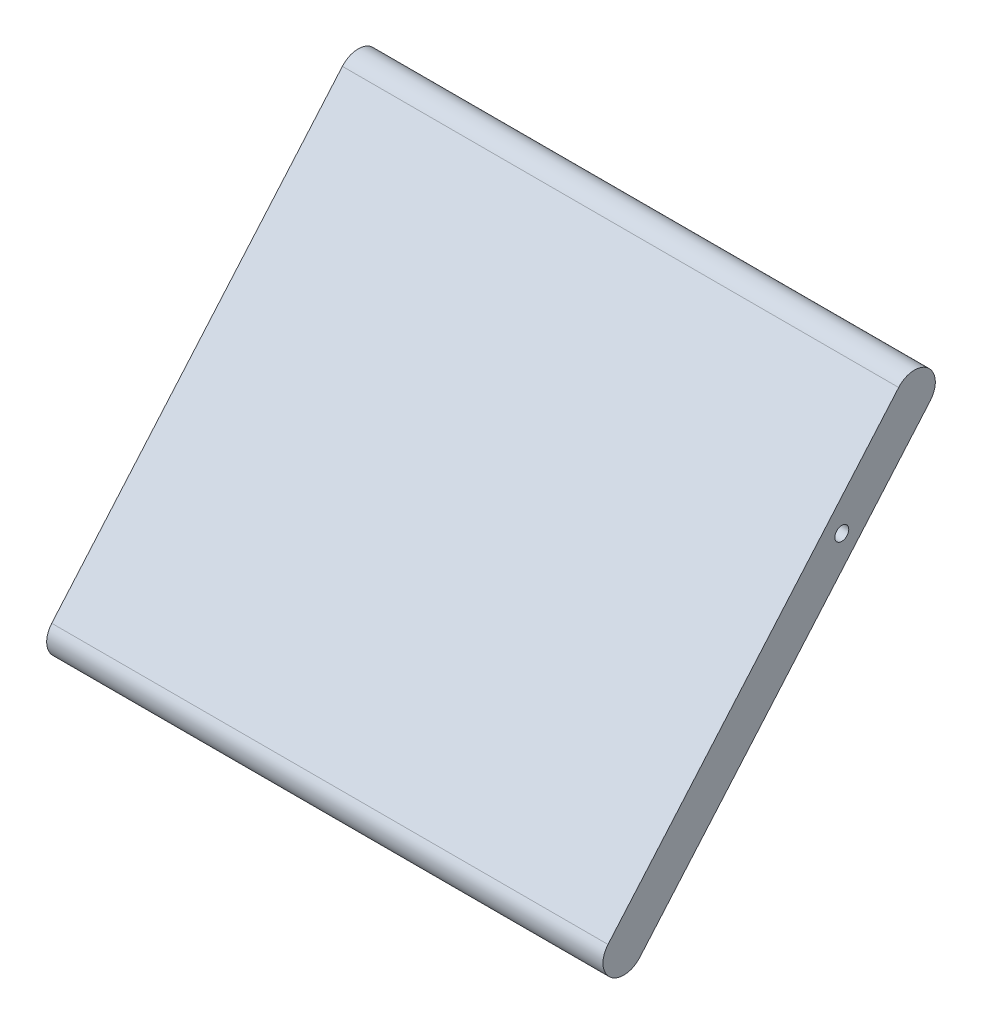
ISO-10303-21;
HEADER;
FILE_DESCRIPTION(('STEP AP214'),'2;1');
FILE_NAME('part.step','',(''),(''),'','','');
FILE_SCHEMA(('AUTOMOTIVE_DESIGN { 1 0 10303 214 1 1 1 1 }'));
ENDSEC;
DATA;
#1=APPLICATION_CONTEXT('core data for automotive mechanical design processes');
#2=APPLICATION_PROTOCOL_DEFINITION('international standard','automotive_design',2000,#1);
#3=PRODUCT_CONTEXT('',#1,'mechanical');
#4=PRODUCT('Part','Part','',(#3));
#5=PRODUCT_RELATED_PRODUCT_CATEGORY('part','',(#4));
#6=PRODUCT_DEFINITION_FORMATION('','',#4);
#7=PRODUCT_DEFINITION_CONTEXT('part definition',#1,'design');
#8=PRODUCT_DEFINITION('design','',#6,#7);
#9=PRODUCT_DEFINITION_SHAPE('','',#8);
#10=(LENGTH_UNIT() NAMED_UNIT(*) SI_UNIT(.MILLI.,.METRE.));
#11=(NAMED_UNIT(*) PLANE_ANGLE_UNIT() SI_UNIT($,.RADIAN.));
#12=(NAMED_UNIT(*) SI_UNIT($,.STERADIAN.) SOLID_ANGLE_UNIT());
#13=UNCERTAINTY_MEASURE_WITH_UNIT(LENGTH_MEASURE(1.E-05),#10,'distance_accuracy_value','');
#14=(GEOMETRIC_REPRESENTATION_CONTEXT(3) GLOBAL_UNCERTAINTY_ASSIGNED_CONTEXT((#13)) GLOBAL_UNIT_ASSIGNED_CONTEXT((#10,
#11,#12)) REPRESENTATION_CONTEXT('',''));
#15=CARTESIAN_POINT('',(0.,0.,0.));
#16=DIRECTION('',(0.,0.,1.));
#17=DIRECTION('',(1.,0.,0.));
#18=AXIS2_PLACEMENT_3D('',#15,#16,#17);
#19=CARTESIAN_POINT('',(10.,-14.7005267616368,7.78228177924895));
#20=DIRECTION('',(1.,0.,0.));
#21=DIRECTION('',(0.,0.,-1.));
#22=AXIS2_PLACEMENT_3D('',#19,#20,#21);
#23=PLANE('',#22);
#24=CARTESIAN_POINT('',(10.,-14.7005267616368,7.78228177924895));
#25=DIRECTION('',(1.,0.,0.));
#26=DIRECTION('',(0.,0.,-1.));
#27=AXIS2_PLACEMENT_3D('',#24,#25,#26);
#28=CIRCLE('',#27,0.375000000000001);
#29=CARTESIAN_POINT('',(10.,-14.4556191962666,8.06626291317243));
#30=VERTEX_POINT('',#29);
#31=CARTESIAN_POINT('',(10.,-14.9454343270069,7.49830064532548));
#32=VERTEX_POINT('',#31);
#33=EDGE_CURVE('E85',#30,#32,#28,.T.);
#34=ORIENTED_EDGE('',*,*,#33,.T.);
#35=DIRECTION('',(0.,0.757283023795937,-0.653086840987079));
#36=VECTOR('',#35,1.);
#37=CARTESIAN_POINT('',(10.,-14.9454343270069,7.49830064532548));
#38=LINE('',#37,#36);
#39=CARTESIAN_POINT('',(10.,-8.88717013663941,2.27360591742884));
#40=VERTEX_POINT('',#39);
#41=EDGE_CURVE('E80',#32,#40,#38,.T.);
#42=ORIENTED_EDGE('',*,*,#41,.T.);
#43=CARTESIAN_POINT('',(10.,-8.64226257126925,2.55758705135232));
#44=DIRECTION('',(1.,0.,0.));
#45=DIRECTION('',(0.,0.,-1.));
#46=AXIS2_PLACEMENT_3D('',#43,#44,#45);
#47=CIRCLE('',#46,0.374999999999999);
#48=CARTESIAN_POINT('',(10.,-8.3973550058991,2.8415681852758));
#49=VERTEX_POINT('',#48);
#50=EDGE_CURVE('E83',#40,#49,#47,.T.);
#51=ORIENTED_EDGE('',*,*,#50,.T.);
#52=DIRECTION('',(0.,-0.757283023795937,0.653086840987079));
#53=VECTOR('',#52,1.);
#54=CARTESIAN_POINT('',(10.,-14.4556191962666,8.06626291317243));
#55=LINE('',#54,#53);
#56=EDGE_CURVE('E50',#49,#30,#55,.T.);
#57=ORIENTED_EDGE('',*,*,#56,.T.);
#58=EDGE_LOOP('',(#34,#42,#51,#57));
#59=FACE_BOUND('',#58,.T.);
#60=CARTESIAN_POINT('',(10.,-10.1568286188611,3.86376073332648));
#61=DIRECTION('',(1.,0.,0.));
#62=DIRECTION('',(0.,0.,-1.));
#63=AXIS2_PLACEMENT_3D('',#60,#61,#62);
#64=CIRCLE('',#63,0.125);
#65=CARTESIAN_POINT('',(10.,-10.1568286188611,3.73876073332648));
#66=VERTEX_POINT('',#65);
#67=EDGE_CURVE('E100',#66,#66,#64,.T.);
#68=ORIENTED_EDGE('',*,*,#67,.F.);
#69=EDGE_LOOP('',(#68));
#70=FACE_BOUND('',#69,.T.);
#71=ADVANCED_FACE('F33',(#59,#70),#23,.T.);
#72=CARTESIAN_POINT('',(0.,-14.7005267616368,7.78228177924895));
#73=DIRECTION('',(1.,0.,0.));
#74=DIRECTION('',(0.,0.,-1.));
#75=AXIS2_PLACEMENT_3D('',#72,#73,#74);
#76=PLANE('',#75);
#77=CARTESIAN_POINT('',(0.,-14.7005267616368,7.78228177924895));
#78=DIRECTION('',(1.,0.,0.));
#79=DIRECTION('',(0.,0.,-1.));
#80=AXIS2_PLACEMENT_3D('',#77,#78,#79);
#81=CIRCLE('',#80,0.375000000000001);
#82=CARTESIAN_POINT('',(0.,-14.4556191962666,8.06626291317243));
#83=VERTEX_POINT('',#82);
#84=CARTESIAN_POINT('',(0.,-14.9454343270069,7.49830064532548));
#85=VERTEX_POINT('',#84);
#86=EDGE_CURVE('E97',#83,#85,#81,.T.);
#87=ORIENTED_EDGE('',*,*,#86,.F.);
#88=DIRECTION('',(0.,-0.757283023795937,0.653086840987079));
#89=VECTOR('',#88,1.);
#90=CARTESIAN_POINT('',(0.,-14.4556191962666,8.06626291317243));
#91=LINE('',#90,#89);
#92=CARTESIAN_POINT('',(0.,-8.3973550058991,2.8415681852758));
#93=VERTEX_POINT('',#92);
#94=EDGE_CURVE('E73',#93,#83,#91,.T.);
#95=ORIENTED_EDGE('',*,*,#94,.F.);
#96=CARTESIAN_POINT('',(0.,-8.64226257126925,2.55758705135232));
#97=DIRECTION('',(1.,0.,0.));
#98=DIRECTION('',(0.,0.,-1.));
#99=AXIS2_PLACEMENT_3D('',#96,#97,#98);
#100=CIRCLE('',#99,0.374999999999999);
#101=CARTESIAN_POINT('',(0.,-8.88717013663941,2.27360591742884));
#102=VERTEX_POINT('',#101);
#103=EDGE_CURVE('E67',#102,#93,#100,.T.);
#104=ORIENTED_EDGE('',*,*,#103,.F.);
#105=DIRECTION('',(0.,0.757283023795937,-0.653086840987079));
#106=VECTOR('',#105,1.);
#107=CARTESIAN_POINT('',(0.,-14.9454343270069,7.49830064532548));
#108=LINE('',#107,#106);
#109=EDGE_CURVE('E89',#85,#102,#108,.T.);
#110=ORIENTED_EDGE('',*,*,#109,.F.);
#111=EDGE_LOOP('',(#87,#95,#104,#110));
#112=FACE_BOUND('',#111,.T.);
#113=CARTESIAN_POINT('',(0.,-10.1568286188611,3.86376073332648));
#114=DIRECTION('',(1.,0.,0.));
#115=DIRECTION('',(0.,0.,-1.));
#116=AXIS2_PLACEMENT_3D('',#113,#114,#115);
#117=CIRCLE('',#116,0.125);
#118=CARTESIAN_POINT('',(0.,-10.1568286188611,3.73876073332648));
#119=VERTEX_POINT('',#118);
#120=EDGE_CURVE('E112',#119,#119,#117,.T.);
#121=ORIENTED_EDGE('',*,*,#120,.T.);
#122=EDGE_LOOP('',(#121));
#123=FACE_BOUND('',#122,.T.);
#124=ADVANCED_FACE('F108',(#112,#123),#76,.F.);
#125=CARTESIAN_POINT('',(10.,-14.7005267616368,7.78228177924895));
#126=DIRECTION('',(-1.,0.,0.));
#127=DIRECTION('',(0.,0.,1.));
#128=AXIS2_PLACEMENT_3D('',#125,#126,#127);
#129=CYLINDRICAL_SURFACE('',#128,0.375000000000001);
#130=ORIENTED_EDGE('',*,*,#86,.T.);
#131=DIRECTION('',(-1.,0.,0.));
#132=VECTOR('',#131,1.);
#133=CARTESIAN_POINT('',(10.,-14.9454343270069,7.49830064532548));
#134=LINE('',#133,#132);
#135=EDGE_CURVE('E11',#32,#85,#134,.T.);
#136=ORIENTED_EDGE('',*,*,#135,.F.);
#137=ORIENTED_EDGE('',*,*,#33,.F.);
#138=DIRECTION('',(-1.,0.,0.));
#139=VECTOR('',#138,1.);
#140=CARTESIAN_POINT('',(10.,-14.4556191962666,8.06626291317243));
#141=LINE('',#140,#139);
#142=EDGE_CURVE('E93',#30,#83,#141,.T.);
#143=ORIENTED_EDGE('',*,*,#142,.T.);
#144=EDGE_LOOP('',(#130,#136,#137,#143));
#145=FACE_BOUND('',#144,.T.);
#146=ADVANCED_FACE('F35',(#145),#129,.T.);
#147=CARTESIAN_POINT('',(10.,-14.9454343270069,7.49830064532548));
#148=DIRECTION('',(0.,0.653086840987079,0.757283023795937));
#149=DIRECTION('',(0.,-0.757283023795937,0.653086840987079));
#150=AXIS2_PLACEMENT_3D('',#147,#148,#149);
#151=PLANE('',#150);
#152=ORIENTED_EDGE('',*,*,#109,.T.);
#153=DIRECTION('',(-1.,0.,0.));
#154=VECTOR('',#153,1.);
#155=CARTESIAN_POINT('',(10.,-8.88717013663941,2.27360591742884));
#156=LINE('',#155,#154);
#157=EDGE_CURVE('E42',#40,#102,#156,.T.);
#158=ORIENTED_EDGE('',*,*,#157,.F.);
#159=ORIENTED_EDGE('',*,*,#41,.F.);
#160=ORIENTED_EDGE('',*,*,#135,.T.);
#161=EDGE_LOOP('',(#152,#158,#159,#160));
#162=FACE_BOUND('',#161,.T.);
#163=ADVANCED_FACE('F88',(#162),#151,.F.);
#164=CARTESIAN_POINT('',(10.,-8.64226257126925,2.55758705135232));
#165=DIRECTION('',(-1.,0.,0.));
#166=DIRECTION('',(0.,0.,1.));
#167=AXIS2_PLACEMENT_3D('',#164,#165,#166);
#168=CYLINDRICAL_SURFACE('',#167,0.374999999999999);
#169=ORIENTED_EDGE('',*,*,#103,.T.);
#170=DIRECTION('',(-1.,0.,0.));
#171=VECTOR('',#170,1.);
#172=CARTESIAN_POINT('',(10.,-8.3973550058991,2.8415681852758));
#173=LINE('',#172,#171);
#174=EDGE_CURVE('E90',#49,#93,#173,.T.);
#175=ORIENTED_EDGE('',*,*,#174,.F.);
#176=ORIENTED_EDGE('',*,*,#50,.F.);
#177=ORIENTED_EDGE('',*,*,#157,.T.);
#178=EDGE_LOOP('',(#169,#175,#176,#177));
#179=FACE_BOUND('',#178,.T.);
#180=ADVANCED_FACE('F91',(#179),#168,.T.);
#181=CARTESIAN_POINT('',(10.,-14.4556191962666,8.06626291317243));
#182=DIRECTION('',(0.,-0.653086840987079,-0.757283023795937));
#183=DIRECTION('',(0.,0.757283023795937,-0.653086840987079));
#184=AXIS2_PLACEMENT_3D('',#181,#182,#183);
#185=PLANE('',#184);
#186=ORIENTED_EDGE('',*,*,#94,.T.);
#187=ORIENTED_EDGE('',*,*,#142,.F.);
#188=ORIENTED_EDGE('',*,*,#56,.F.);
#189=ORIENTED_EDGE('',*,*,#174,.T.);
#190=EDGE_LOOP('',(#186,#187,#188,#189));
#191=FACE_BOUND('',#190,.T.);
#192=ADVANCED_FACE('F105',(#191),#185,.F.);
#193=CARTESIAN_POINT('',(10.,-10.1568286188611,3.86376073332648));
#194=DIRECTION('',(-1.,0.,0.));
#195=DIRECTION('',(0.,0.,1.));
#196=AXIS2_PLACEMENT_3D('',#193,#194,#195);
#197=CYLINDRICAL_SURFACE('',#196,0.125);
#198=ORIENTED_EDGE('',*,*,#67,.T.);
#199=EDGE_LOOP('',(#198));
#200=FACE_BOUND('',#199,.T.);
#201=ORIENTED_EDGE('',*,*,#120,.F.);
#202=EDGE_LOOP('',(#201));
#203=FACE_BOUND('',#202,.T.);
#204=ADVANCED_FACE('F118',(#200,#203),#197,.F.);
#205=CLOSED_SHELL('',(#71,#124,#146,#163,#180,#192,#204));
#206=MANIFOLD_SOLID_BREP('B2',#205);
#207=ADVANCED_BREP_SHAPE_REPRESENTATION('',(#18,#206),#14);
#208=SHAPE_DEFINITION_REPRESENTATION(#9,#207);
ENDSEC;
END-ISO-10303-21;
